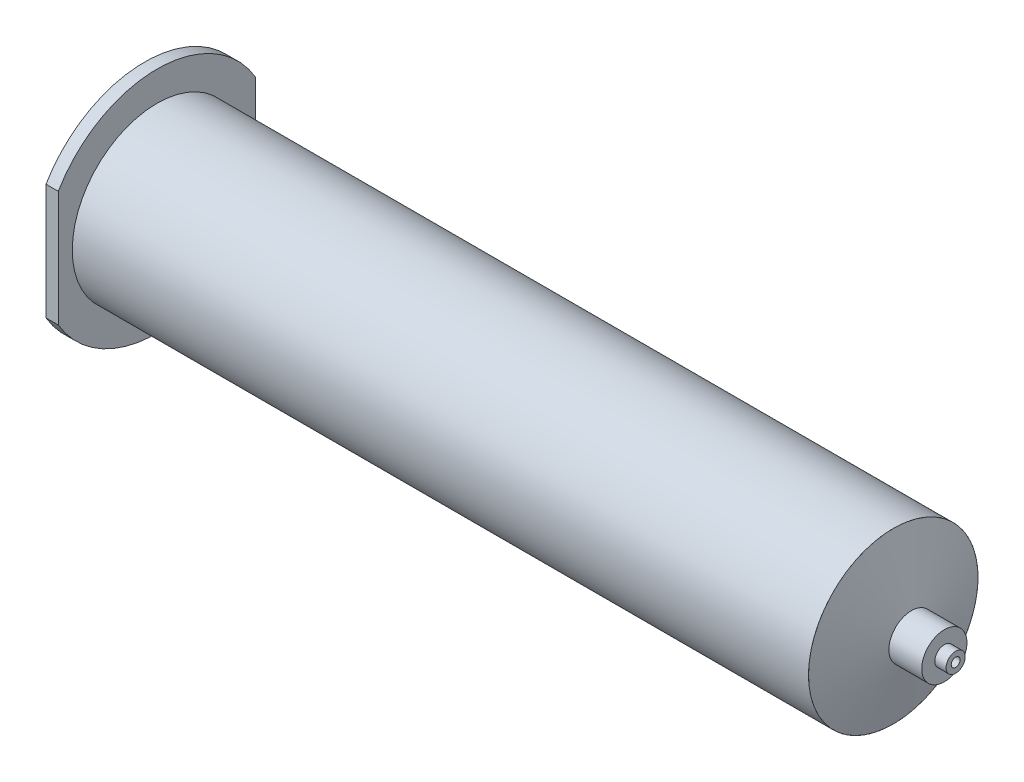
ISO-10303-21;
HEADER;
FILE_DESCRIPTION(('STEP AP214'),'2;1');
FILE_NAME('part.step','',(''),(''),'','','');
FILE_SCHEMA(('AUTOMOTIVE_DESIGN { 1 0 10303 214 1 1 1 1 }'));
ENDSEC;
DATA;
#1=APPLICATION_CONTEXT('core data for automotive mechanical design processes');
#2=APPLICATION_PROTOCOL_DEFINITION('international standard','automotive_design',2000,#1);
#3=PRODUCT_CONTEXT('',#1,'mechanical');
#4=PRODUCT('Part','Part','',(#3));
#5=PRODUCT_RELATED_PRODUCT_CATEGORY('part','',(#4));
#6=PRODUCT_DEFINITION_FORMATION('','',#4);
#7=PRODUCT_DEFINITION_CONTEXT('part definition',#1,'design');
#8=PRODUCT_DEFINITION('design','',#6,#7);
#9=PRODUCT_DEFINITION_SHAPE('','',#8);
#10=(LENGTH_UNIT() NAMED_UNIT(*) SI_UNIT(.MILLI.,.METRE.));
#11=(NAMED_UNIT(*) PLANE_ANGLE_UNIT() SI_UNIT($,.RADIAN.));
#12=(NAMED_UNIT(*) SI_UNIT($,.STERADIAN.) SOLID_ANGLE_UNIT());
#13=UNCERTAINTY_MEASURE_WITH_UNIT(LENGTH_MEASURE(1.E-05),#10,'distance_accuracy_value','');
#14=(GEOMETRIC_REPRESENTATION_CONTEXT(3) GLOBAL_UNCERTAINTY_ASSIGNED_CONTEXT((#13)) GLOBAL_UNIT_ASSIGNED_CONTEXT((#10,
#11,#12)) REPRESENTATION_CONTEXT('',''));
#15=CARTESIAN_POINT('',(0.,0.,0.));
#16=DIRECTION('',(0.,0.,1.));
#17=DIRECTION('',(1.,0.,0.));
#18=AXIS2_PLACEMENT_3D('',#15,#16,#17);
#19=CARTESIAN_POINT('',(0.,0.,0.));
#20=DIRECTION('',(1.,0.,0.));
#21=DIRECTION('',(0.,0.,-1.));
#22=AXIS2_PLACEMENT_3D('',#19,#20,#21);
#23=PLANE('',#22);
#24=CARTESIAN_POINT('',(0.,0.,17.25));
#25=DIRECTION('',(-1.,0.,0.));
#26=DIRECTION('',(0.,0.,1.));
#27=AXIS2_PLACEMENT_3D('',#24,#25,#26);
#28=CIRCLE('',#27,0.899999999999953);
#29=CARTESIAN_POINT('',(0.,0.,18.15));
#30=VERTEX_POINT('',#29);
#31=EDGE_CURVE('E67',#30,#30,#28,.T.);
#32=ORIENTED_EDGE('',*,*,#31,.T.);
#33=EDGE_LOOP('',(#32));
#34=FACE_BOUND('',#33,.T.);
#35=CARTESIAN_POINT('',(0.,0.,17.25));
#36=DIRECTION('',(1.,0.,0.));
#37=DIRECTION('',(0.,0.,-1.));
#38=AXIS2_PLACEMENT_3D('',#35,#36,#37);
#39=CIRCLE('',#38,1.94999999999998);
#40=CARTESIAN_POINT('',(0.,0.,15.3));
#41=VERTEX_POINT('',#40);
#42=EDGE_CURVE('E61',#41,#41,#39,.T.);
#43=ORIENTED_EDGE('',*,*,#42,.T.);
#44=EDGE_LOOP('',(#43));
#45=FACE_BOUND('',#44,.T.);
#46=ADVANCED_FACE('F54',(#34,#45),#23,.T.);
#47=CARTESIAN_POINT('',(-2.3,0.,0.));
#48=DIRECTION('',(1.,0.,0.));
#49=DIRECTION('',(0.,0.,-1.));
#50=AXIS2_PLACEMENT_3D('',#47,#48,#49);
#51=PLANE('',#50);
#52=CARTESIAN_POINT('',(-2.3,0.,17.25));
#53=DIRECTION('',(1.,0.,0.));
#54=DIRECTION('',(0.,0.,-1.));
#55=AXIS2_PLACEMENT_3D('',#52,#53,#54);
#56=CIRCLE('',#55,0.899999999999953);
#57=CARTESIAN_POINT('',(-2.3,0.,16.3500000000001));
#58=VERTEX_POINT('',#57);
#59=EDGE_CURVE('E57',#58,#58,#56,.T.);
#60=ORIENTED_EDGE('',*,*,#59,.T.);
#61=EDGE_LOOP('',(#60));
#62=FACE_BOUND('',#61,.T.);
#63=CARTESIAN_POINT('',(-2.3,0.,17.25));
#64=DIRECTION('',(1.,0.,0.));
#65=DIRECTION('',(0.,0.,-1.));
#66=AXIS2_PLACEMENT_3D('',#63,#64,#65);
#67=CIRCLE('',#66,1.94999999999998);
#68=CARTESIAN_POINT('',(-2.3,0.,15.3));
#69=VERTEX_POINT('',#68);
#70=EDGE_CURVE('E11',#69,#69,#67,.T.);
#71=ORIENTED_EDGE('',*,*,#70,.F.);
#72=EDGE_LOOP('',(#71));
#73=FACE_BOUND('',#72,.T.);
#74=ADVANCED_FACE('F74',(#62,#73),#51,.F.);
#75=CARTESIAN_POINT('',(0.,0.,17.25));
#76=DIRECTION('',(1.,0.,0.));
#77=DIRECTION('',(0.,0.,-1.));
#78=AXIS2_PLACEMENT_3D('',#75,#76,#77);
#79=CYLINDRICAL_SURFACE('',#78,1.94999999999998);
#80=ORIENTED_EDGE('',*,*,#42,.F.);
#81=EDGE_LOOP('',(#80));
#82=FACE_BOUND('',#81,.T.);
#83=ORIENTED_EDGE('',*,*,#70,.T.);
#84=EDGE_LOOP('',(#83));
#85=FACE_BOUND('',#84,.T.);
#86=ADVANCED_FACE('F79',(#82,#85),#79,.T.);
#87=CARTESIAN_POINT('',(-165.1,0.,17.25));
#88=DIRECTION('',(-1.,0.,0.));
#89=DIRECTION('',(0.,0.,1.));
#90=AXIS2_PLACEMENT_3D('',#87,#88,#89);
#91=CYLINDRICAL_SURFACE('',#90,0.899999999999953);
#92=ORIENTED_EDGE('',*,*,#31,.F.);
#93=EDGE_LOOP('',(#92));
#94=FACE_BOUND('',#93,.T.);
#95=ORIENTED_EDGE('',*,*,#59,.F.);
#96=EDGE_LOOP('',(#95));
#97=FACE_BOUND('',#96,.T.);
#98=ADVANCED_FACE('F77',(#94,#97),#91,.F.);
#99=CLOSED_SHELL('',(#46,#74,#86,#98));
#100=MANIFOLD_SOLID_BREP('B2',#99);
#101=CARTESIAN_POINT('',(-9.,0.,0.));
#102=DIRECTION('',(-1.,0.,0.));
#103=DIRECTION('',(0.,0.,1.));
#104=AXIS2_PLACEMENT_3D('',#101,#102,#103);
#105=PLANE('',#104);
#106=CARTESIAN_POINT('',(-9.00000000000001,0.,17.25));
#107=DIRECTION('',(-1.,0.,0.));
#108=DIRECTION('',(0.,0.,1.));
#109=AXIS2_PLACEMENT_3D('',#106,#107,#108);
#110=CIRCLE('',#109,0.899999999999953);
#111=CARTESIAN_POINT('',(-9.00000000000001,0.,18.15));
#112=VERTEX_POINT('',#111);
#113=EDGE_CURVE('E150',#112,#112,#110,.T.);
#114=ORIENTED_EDGE('',*,*,#113,.T.);
#115=EDGE_LOOP('',(#114));
#116=FACE_BOUND('',#115,.T.);
#117=CARTESIAN_POINT('',(-9.,0.,17.25));
#118=DIRECTION('',(1.,0.,0.));
#119=DIRECTION('',(0.,0.,-1.));
#120=AXIS2_PLACEMENT_3D('',#117,#118,#119);
#121=CIRCLE('',#120,1.95000000000003);
#122=CARTESIAN_POINT('',(-9.,0.,15.3));
#123=VERTEX_POINT('',#122);
#124=EDGE_CURVE('E53',#123,#123,#121,.T.);
#125=ORIENTED_EDGE('',*,*,#124,.T.);
#126=EDGE_LOOP('',(#125));
#127=FACE_BOUND('',#126,.T.);
#128=ADVANCED_FACE('F128',(#116,#127),#105,.F.);
#129=CARTESIAN_POINT('',(0.,0.,17.25));
#130=DIRECTION('',(1.,0.,0.));
#131=DIRECTION('',(0.,0.,-1.));
#132=AXIS2_PLACEMENT_3D('',#129,#130,#131);
#133=CYLINDRICAL_SURFACE('',#132,1.95000000000003);
#134=CARTESIAN_POINT('',(-2.3,0.,17.25));
#135=DIRECTION('',(1.,0.,0.));
#136=DIRECTION('',(0.,0.,-1.));
#137=AXIS2_PLACEMENT_3D('',#134,#135,#136);
#138=CIRCLE('',#137,1.95000000000003);
#139=CARTESIAN_POINT('',(-2.3,0.,15.3));
#140=VERTEX_POINT('',#139);
#141=EDGE_CURVE('E134',#140,#140,#138,.T.);
#142=ORIENTED_EDGE('',*,*,#141,.T.);
#143=EDGE_LOOP('',(#142));
#144=FACE_BOUND('',#143,.T.);
#145=ORIENTED_EDGE('',*,*,#124,.F.);
#146=EDGE_LOOP('',(#145));
#147=FACE_BOUND('',#146,.T.);
#148=ADVANCED_FACE('F175',(#144,#147),#133,.F.);
#149=CARTESIAN_POINT('',(-2.3,0.,0.));
#150=DIRECTION('',(-1.,0.,0.));
#151=DIRECTION('',(0.,0.,1.));
#152=AXIS2_PLACEMENT_3D('',#149,#150,#151);
#153=PLANE('',#152);
#154=ORIENTED_EDGE('',*,*,#141,.F.);
#155=EDGE_LOOP('',(#154));
#156=FACE_BOUND('',#155,.T.);
#157=CARTESIAN_POINT('',(-2.3,0.,17.25));
#158=DIRECTION('',(1.,0.,0.));
#159=DIRECTION('',(0.,0.,-1.));
#160=AXIS2_PLACEMENT_3D('',#157,#158,#159);
#161=CIRCLE('',#160,4.60000000000003);
#162=CARTESIAN_POINT('',(-2.3,0.,12.65));
#163=VERTEX_POINT('',#162);
#164=EDGE_CURVE('E138',#163,#163,#161,.T.);
#165=ORIENTED_EDGE('',*,*,#164,.T.);
#166=EDGE_LOOP('',(#165));
#167=FACE_BOUND('',#166,.T.);
#168=ADVANCED_FACE('F180',(#156,#167),#153,.F.);
#169=CARTESIAN_POINT('',(0.,0.,17.25));
#170=DIRECTION('',(1.,0.,0.));
#171=DIRECTION('',(0.,0.,-1.));
#172=AXIS2_PLACEMENT_3D('',#169,#170,#171);
#173=CYLINDRICAL_SURFACE('',#172,4.60000000000003);
#174=ORIENTED_EDGE('',*,*,#164,.F.);
#175=EDGE_LOOP('',(#174));
#176=FACE_BOUND('',#175,.T.);
#177=CARTESIAN_POINT('',(-9.,0.,17.25));
#178=DIRECTION('',(1.,0.,0.));
#179=DIRECTION('',(0.,0.,-1.));
#180=AXIS2_PLACEMENT_3D('',#177,#178,#179);
#181=CIRCLE('',#180,4.60000000000003);
#182=CARTESIAN_POINT('',(-8.99999999999999,0.,21.85));
#183=VERTEX_POINT('',#182);
#184=EDGE_CURVE('E142',#183,#183,#181,.T.);
#185=ORIENTED_EDGE('',*,*,#184,.T.);
#186=EDGE_LOOP('',(#185));
#187=FACE_BOUND('',#186,.T.);
#188=ADVANCED_FACE('F171',(#176,#187),#173,.T.);
#189=CARTESIAN_POINT('',(-12.7,0.,17.25));
#190=DIRECTION('',(-1.,0.,0.));
#191=DIRECTION('',(0.,0.,1.));
#192=AXIS2_PLACEMENT_3D('',#189,#190,#191);
#193=CONICAL_SURFACE('',#192,17.25,1.28624349239073);
#194=CARTESIAN_POINT('',(-12.7,0.,17.25));
#195=DIRECTION('',(1.,0.,0.));
#196=DIRECTION('',(0.,0.,-1.));
#197=AXIS2_PLACEMENT_3D('',#194,#195,#196);
#198=CIRCLE('',#197,17.25);
#199=CARTESIAN_POINT('',(-12.7,0.,34.5));
#200=VERTEX_POINT('',#199);
#201=EDGE_CURVE('E147',#200,#200,#198,.T.);
#202=CARTESIAN_POINT('',(-8.99999999999999,0.,21.85));
#203=CARTESIAN_POINT('',(-9.03854166666666,0.,21.9817708333334));
#204=CARTESIAN_POINT('',(-9.07708333333333,0.,22.1135416666667));
#205=CARTESIAN_POINT('',(-9.15416666666666,0.,22.3770833333334));
#206=CARTESIAN_POINT('',(-9.19270833333333,0.,22.5088541666667));
#207=CARTESIAN_POINT('',(-9.26979166666666,0.,22.7723958333334));
#208=CARTESIAN_POINT('',(-9.30833333333333,0.,22.9041666666667));
#209=CARTESIAN_POINT('',(-9.38541666666666,0.,23.1677083333334));
#210=CARTESIAN_POINT('',(-9.42395833333333,0.,23.2994791666667));
#211=CARTESIAN_POINT('',(-9.50104166666666,0.,23.5630208333334));
#212=CARTESIAN_POINT('',(-9.53958333333333,0.,23.6947916666667));
#213=CARTESIAN_POINT('',(-9.61666666666666,0.,23.9583333333334));
#214=CARTESIAN_POINT('',(-9.65520833333333,0.,24.0901041666667));
#215=CARTESIAN_POINT('',(-9.73229166666666,0.,24.3536458333334));
#216=CARTESIAN_POINT('',(-9.77083333333333,0.,24.4854166666667));
#217=CARTESIAN_POINT('',(-9.84791666666666,0.,24.7489583333334));
#218=CARTESIAN_POINT('',(-9.88645833333332,0.,24.8807291666667));
#219=CARTESIAN_POINT('',(-9.96354166666666,0.,25.1442708333334));
#220=CARTESIAN_POINT('',(-10.0020833333333,0.,25.2760416666667));
#221=CARTESIAN_POINT('',(-10.0791666666667,0.,25.5395833333334));
#222=CARTESIAN_POINT('',(-10.1177083333333,0.,25.6713541666667));
#223=CARTESIAN_POINT('',(-10.1947916666667,0.,25.9348958333334));
#224=CARTESIAN_POINT('',(-10.2333333333333,0.,26.0666666666667));
#225=CARTESIAN_POINT('',(-10.3104166666667,0.,26.3302083333334));
#226=CARTESIAN_POINT('',(-10.3489583333333,0.,26.4619791666667));
#227=CARTESIAN_POINT('',(-10.4260416666667,0.,26.7255208333334));
#228=CARTESIAN_POINT('',(-10.4645833333333,0.,26.8572916666667));
#229=CARTESIAN_POINT('',(-10.5416666666667,0.,27.1208333333334));
#230=CARTESIAN_POINT('',(-10.5802083333333,0.,27.2526041666667));
#231=CARTESIAN_POINT('',(-10.6572916666667,0.,27.5161458333334));
#232=CARTESIAN_POINT('',(-10.6958333333333,0.,27.6479166666667));
#233=CARTESIAN_POINT('',(-10.7729166666667,0.,27.9114583333334));
#234=CARTESIAN_POINT('',(-10.8114583333333,0.,28.0432291666667));
#235=CARTESIAN_POINT('',(-10.8885416666667,0.,28.3067708333334));
#236=CARTESIAN_POINT('',(-10.9270833333333,0.,28.4385416666667));
#237=CARTESIAN_POINT('',(-11.0041666666667,0.,28.7020833333334));
#238=CARTESIAN_POINT('',(-11.0427083333333,0.,28.8338541666667));
#239=CARTESIAN_POINT('',(-11.1197916666667,0.,29.0973958333334));
#240=CARTESIAN_POINT('',(-11.1583333333333,0.,29.2291666666667));
#241=CARTESIAN_POINT('',(-11.2354166666667,0.,29.4927083333334));
#242=CARTESIAN_POINT('',(-11.2739583333333,0.,29.6244791666667));
#243=CARTESIAN_POINT('',(-11.3510416666667,0.,29.8880208333333));
#244=CARTESIAN_POINT('',(-11.3895833333333,0.,30.0197916666667));
#245=CARTESIAN_POINT('',(-11.4666666666666,0.,30.2833333333334));
#246=CARTESIAN_POINT('',(-11.5052083333333,0.,30.4151041666667));
#247=CARTESIAN_POINT('',(-11.5822916666667,0.,30.6786458333334));
#248=CARTESIAN_POINT('',(-11.6208333333333,0.,30.8104166666667));
#249=CARTESIAN_POINT('',(-11.6979166666667,0.,31.0739583333333));
#250=CARTESIAN_POINT('',(-11.7364583333333,0.,31.2057291666667));
#251=CARTESIAN_POINT('',(-11.8135416666666,0.,31.4692708333333));
#252=CARTESIAN_POINT('',(-11.8520833333333,0.,31.6010416666667));
#253=CARTESIAN_POINT('',(-11.9291666666666,0.,31.8645833333333));
#254=CARTESIAN_POINT('',(-11.9677083333333,0.,31.9963541666667));
#255=CARTESIAN_POINT('',(-12.0447916666666,0.,32.2598958333334));
#256=CARTESIAN_POINT('',(-12.0833333333333,0.,32.3916666666667));
#257=CARTESIAN_POINT('',(-12.1604166666666,0.,32.6552083333333));
#258=CARTESIAN_POINT('',(-12.1989583333333,0.,32.7869791666667));
#259=CARTESIAN_POINT('',(-12.2760416666666,0.,33.0505208333333));
#260=CARTESIAN_POINT('',(-12.3145833333333,0.,33.1822916666667));
#261=CARTESIAN_POINT('',(-12.3916666666666,0.,33.4458333333333));
#262=CARTESIAN_POINT('',(-12.4302083333333,0.,33.5776041666667));
#263=CARTESIAN_POINT('',(-12.5072916666666,0.,33.8411458333333));
#264=CARTESIAN_POINT('',(-12.5458333333333,0.,33.9729166666667));
#265=CARTESIAN_POINT('',(-12.6229166666666,0.,34.2364583333333));
#266=CARTESIAN_POINT('',(-12.6614583333333,0.,34.3682291666667));
#267=CARTESIAN_POINT('',(-12.7,0.,34.5));
#268=B_SPLINE_CURVE_WITH_KNOTS('',3,(#202,#203,#204,#205,#206,#207,#208,#209,#210,#211,#212,
#213,#214,#215,#216,#217,#218,#219,#220,#221,#222,#223,#224,#225,#226,#227,#228,#229,#230,#231,
#232,#233,#234,#235,#236,#237,#238,#239,#240,#241,#242,#243,#244,#245,#246,#247,#248,#249,#250,
#251,#252,#253,#254,#255,#256,#257,#258,#259,#260,#261,#262,#263,#264,#265,#266,#267),
.UNSPECIFIED.,.F.,.F.,(4,2,2,2,2,2,2,2,2,2,2,2,2,2,2,2,2,2,2,2,2,2,2,2,2,2,2,2,2,2,2,2,4),(0.,
0.411875118550816,0.823750237101632,1.23562535565245,1.64750047420327,2.05937559275408,
2.4712507113049,2.88312582985572,3.29500094840653,3.70687606695735,4.11875118550817,
4.53062630405898,4.9425014226098,5.35437654116061,5.76625165971143,6.17812677826225,
6.59000189681307,7.00187701536388,7.4137521339147,7.82562725246552,8.23750237101633,
8.64937748956715,9.06125260811797,9.47312772666878,9.8850028452196,10.2968779637704,
10.7087530823212,11.120628200872,11.5325033194229,11.9443784379737,12.3562535565245,
12.7681286750753,13.1800037936261),.UNSPECIFIED.);
#269=EDGE_CURVE('BSEAM162',#183,#200,#268,.T.);
#270=ORIENTED_EDGE('',*,*,#184,.F.);
#271=ORIENTED_EDGE('',*,*,#201,.T.);
#272=ORIENTED_EDGE('',*,*,#269,.T.);
#273=ORIENTED_EDGE('',*,*,#269,.F.);
#274=EDGE_LOOP('',(#270,#272,#271,#273));
#275=FACE_BOUND('',#274,.T.);
#276=ADVANCED_FACE('F162',(#275),#193,.T.);
#277=CARTESIAN_POINT('',(-12.7,0.,0.));
#278=DIRECTION('',(-1.,0.,0.));
#279=DIRECTION('',(0.,0.,1.));
#280=AXIS2_PLACEMENT_3D('',#277,#278,#279);
#281=PLANE('',#280);
#282=ORIENTED_EDGE('',*,*,#201,.F.);
#283=EDGE_LOOP('',(#282));
#284=FACE_BOUND('',#283,.T.);
#285=CARTESIAN_POINT('',(-12.7,0.,17.25));
#286=DIRECTION('',(-1.,0.,0.));
#287=DIRECTION('',(0.,0.,1.));
#288=AXIS2_PLACEMENT_3D('',#285,#286,#287);
#289=CIRCLE('',#288,0.899999999999953);
#290=CARTESIAN_POINT('',(-12.7,0.,18.15));
#291=VERTEX_POINT('',#290);
#292=EDGE_CURVE('E153',#291,#291,#289,.T.);
#293=ORIENTED_EDGE('',*,*,#292,.F.);
#294=EDGE_LOOP('',(#293));
#295=FACE_BOUND('',#294,.T.);
#296=ADVANCED_FACE('F160',(#284,#295),#281,.T.);
#297=CARTESIAN_POINT('',(-165.1,0.,17.25));
#298=DIRECTION('',(-1.,0.,0.));
#299=DIRECTION('',(0.,0.,1.));
#300=AXIS2_PLACEMENT_3D('',#297,#298,#299);
#301=CYLINDRICAL_SURFACE('',#300,0.899999999999953);
#302=ORIENTED_EDGE('',*,*,#292,.T.);
#303=EDGE_LOOP('',(#302));
#304=FACE_BOUND('',#303,.T.);
#305=ORIENTED_EDGE('',*,*,#113,.F.);
#306=EDGE_LOOP('',(#305));
#307=FACE_BOUND('',#306,.T.);
#308=ADVANCED_FACE('F157',(#304,#307),#301,.F.);
#309=CLOSED_SHELL('',(#128,#148,#168,#188,#276,#296,#308));
#310=MANIFOLD_SOLID_BREP('B6',#309);
#311=CARTESIAN_POINT('',(0.,0.,17.25));
#312=DIRECTION('',(1.,0.,0.));
#313=DIRECTION('',(0.,0.,-1.));
#314=AXIS2_PLACEMENT_3D('',#311,#312,#313);
#315=CYLINDRICAL_SURFACE('',#314,17.25);
#316=CARTESIAN_POINT('',(-12.7,0.,17.25));
#317=DIRECTION('',(1.,0.,0.));
#318=DIRECTION('',(0.,0.,-1.));
#319=AXIS2_PLACEMENT_3D('',#316,#317,#318);
#320=CIRCLE('',#319,17.2500000000001);
#321=CARTESIAN_POINT('',(-12.7,0.,0.));
#322=VERTEX_POINT('',#321);
#323=EDGE_CURVE('E126',#322,#322,#320,.T.);
#324=ORIENTED_EDGE('',*,*,#323,.F.);
#325=EDGE_LOOP('',(#324));
#326=FACE_BOUND('',#325,.T.);
#327=CARTESIAN_POINT('',(-162.6,0.,17.2500000000001));
#328=DIRECTION('',(-1.,0.,0.));
#329=DIRECTION('',(0.,0.,1.));
#330=AXIS2_PLACEMENT_3D('',#327,#328,#329);
#331=CIRCLE('',#330,17.25);
#332=CARTESIAN_POINT('',(-162.6,0.,34.5000000000001));
#333=VERTEX_POINT('',#332);
#334=EDGE_CURVE('E242',#333,#333,#331,.F.);
#335=ORIENTED_EDGE('',*,*,#334,.T.);
#336=EDGE_LOOP('',(#335));
#337=FACE_BOUND('',#336,.T.);
#338=ADVANCED_FACE('F238',(#326,#337),#315,.T.);
#339=CARTESIAN_POINT('',(-12.7,0.,0.));
#340=DIRECTION('',(1.,0.,0.));
#341=DIRECTION('',(0.,0.,-1.));
#342=AXIS2_PLACEMENT_3D('',#339,#340,#341);
#343=PLANE('',#342);
#344=CARTESIAN_POINT('',(-12.7,0.,17.25));
#345=DIRECTION('',(-1.,0.,0.));
#346=DIRECTION('',(0.,0.,1.));
#347=AXIS2_PLACEMENT_3D('',#344,#345,#346);
#348=CIRCLE('',#347,15.4499999999999);
#349=CARTESIAN_POINT('',(-12.7,0.,32.7));
#350=VERTEX_POINT('',#349);
#351=EDGE_CURVE('E315',#350,#350,#348,.T.);
#352=ORIENTED_EDGE('',*,*,#351,.T.);
#353=EDGE_LOOP('',(#352));
#354=FACE_BOUND('',#353,.T.);
#355=ORIENTED_EDGE('',*,*,#323,.T.);
#356=EDGE_LOOP('',(#355));
#357=FACE_BOUND('',#356,.T.);
#358=ADVANCED_FACE('F240',(#354,#357),#343,.T.);
#359=CARTESIAN_POINT('',(-162.6,0.,17.2500000000001));
#360=DIRECTION('',(-1.,0.,0.));
#361=DIRECTION('',(0.,0.,1.));
#362=AXIS2_PLACEMENT_3D('',#359,#360,#361);
#363=CYLINDRICAL_SURFACE('',#362,23.3);
#364=CARTESIAN_POINT('',(-165.1,0.,17.2500000000001));
#365=DIRECTION('',(-1.,0.,0.));
#366=DIRECTION('',(0.,0.,1.));
#367=AXIS2_PLACEMENT_3D('',#364,#365,#366);
#368=CIRCLE('',#367,23.3);
#369=CARTESIAN_POINT('',(-165.1,-11.784735890125,-2.84999999999994));
#370=VERTEX_POINT('',#369);
#371=CARTESIAN_POINT('',(-165.1,-11.784735890125,37.3500000000001));
#372=VERTEX_POINT('',#371);
#373=EDGE_CURVE('E310',#370,#372,#368,.T.);
#374=ORIENTED_EDGE('',*,*,#373,.F.);
#375=DIRECTION('',(-1.,0.,0.));
#376=VECTOR('',#375,1.);
#377=CARTESIAN_POINT('',(-162.6,-11.784735890125,-2.84999999999994));
#378=LINE('',#377,#376);
#379=CARTESIAN_POINT('',(-162.6,-11.784735890125,-2.84999999999994));
#380=VERTEX_POINT('',#379);
#381=EDGE_CURVE('E256',#380,#370,#378,.T.);
#382=ORIENTED_EDGE('',*,*,#381,.F.);
#383=CARTESIAN_POINT('',(-162.6,0.,17.2500000000001));
#384=DIRECTION('',(-1.,0.,0.));
#385=DIRECTION('',(0.,0.,1.));
#386=AXIS2_PLACEMENT_3D('',#383,#384,#385);
#387=CIRCLE('',#386,23.3);
#388=CARTESIAN_POINT('',(-162.6,-11.784735890125,37.3500000000001));
#389=VERTEX_POINT('',#388);
#390=EDGE_CURVE('E300',#380,#389,#387,.T.);
#391=ORIENTED_EDGE('',*,*,#390,.T.);
#392=DIRECTION('',(-1.,0.,0.));
#393=VECTOR('',#392,1.);
#394=CARTESIAN_POINT('',(-162.6,-11.784735890125,37.3500000000001));
#395=LINE('',#394,#393);
#396=EDGE_CURVE('E296',#389,#372,#395,.T.);
#397=ORIENTED_EDGE('',*,*,#396,.T.);
#398=EDGE_LOOP('',(#374,#382,#391,#397));
#399=FACE_BOUND('',#398,.T.);
#400=ADVANCED_FACE('F329',(#399),#363,.T.);
#401=CARTESIAN_POINT('',(-162.6,0.,-2.84999999999994));
#402=DIRECTION('',(0.,0.,-1.));
#403=DIRECTION('',(-1.,0.,0.));
#404=AXIS2_PLACEMENT_3D('',#401,#402,#403);
#405=PLANE('',#404);
#406=DIRECTION('',(0.,-1.,0.));
#407=VECTOR('',#406,1.);
#408=CARTESIAN_POINT('',(-165.1,0.,-2.84999999999994));
#409=LINE('',#408,#407);
#410=CARTESIAN_POINT('',(-165.1,11.784735890125,-2.84999999999994));
#411=VERTEX_POINT('',#410);
#412=EDGE_CURVE('E320',#411,#370,#409,.T.);
#413=ORIENTED_EDGE('',*,*,#412,.F.);
#414=DIRECTION('',(-1.,0.,0.));
#415=VECTOR('',#414,1.);
#416=CARTESIAN_POINT('',(-162.6,11.784735890125,-2.84999999999994));
#417=LINE('',#416,#415);
#418=CARTESIAN_POINT('',(-162.6,11.784735890125,-2.84999999999994));
#419=VERTEX_POINT('',#418);
#420=EDGE_CURVE('E273',#419,#411,#417,.T.);
#421=ORIENTED_EDGE('',*,*,#420,.F.);
#422=DIRECTION('',(0.,-1.,0.));
#423=VECTOR('',#422,1.);
#424=CARTESIAN_POINT('',(-162.6,0.,-2.84999999999994));
#425=LINE('',#424,#423);
#426=EDGE_CURVE('E303',#419,#380,#425,.T.);
#427=ORIENTED_EDGE('',*,*,#426,.T.);
#428=ORIENTED_EDGE('',*,*,#381,.T.);
#429=EDGE_LOOP('',(#413,#421,#427,#428));
#430=FACE_BOUND('',#429,.T.);
#431=ADVANCED_FACE('F332',(#430),#405,.T.);
#432=CARTESIAN_POINT('',(-162.6,0.,17.2500000000001));
#433=DIRECTION('',(-1.,0.,0.));
#434=DIRECTION('',(0.,0.,1.));
#435=AXIS2_PLACEMENT_3D('',#432,#433,#434);
#436=CYLINDRICAL_SURFACE('',#435,23.3);
#437=CARTESIAN_POINT('',(-165.1,0.,17.2500000000001));
#438=DIRECTION('',(-1.,0.,0.));
#439=DIRECTION('',(0.,0.,1.));
#440=AXIS2_PLACEMENT_3D('',#437,#438,#439);
#441=CIRCLE('',#440,23.3);
#442=CARTESIAN_POINT('',(-165.1,11.784735890125,37.3500000000001));
#443=VERTEX_POINT('',#442);
#444=EDGE_CURVE('E291',#443,#411,#441,.T.);
#445=ORIENTED_EDGE('',*,*,#444,.F.);
#446=DIRECTION('',(-1.,0.,0.));
#447=VECTOR('',#446,1.);
#448=CARTESIAN_POINT('',(-162.6,11.784735890125,37.3500000000001));
#449=LINE('',#448,#447);
#450=CARTESIAN_POINT('',(-162.6,11.784735890125,37.3500000000001));
#451=VERTEX_POINT('',#450);
#452=EDGE_CURVE('E287',#451,#443,#449,.T.);
#453=ORIENTED_EDGE('',*,*,#452,.F.);
#454=CARTESIAN_POINT('',(-162.6,0.,17.2500000000001));
#455=DIRECTION('',(-1.,0.,0.));
#456=DIRECTION('',(0.,0.,1.));
#457=AXIS2_PLACEMENT_3D('',#454,#455,#456);
#458=CIRCLE('',#457,23.3);
#459=EDGE_CURVE('E289',#451,#419,#458,.T.);
#460=ORIENTED_EDGE('',*,*,#459,.T.);
#461=ORIENTED_EDGE('',*,*,#420,.T.);
#462=EDGE_LOOP('',(#445,#453,#460,#461));
#463=FACE_BOUND('',#462,.T.);
#464=ADVANCED_FACE('F288',(#463),#436,.T.);
#465=CARTESIAN_POINT('',(-162.6,0.,37.3500000000001));
#466=DIRECTION('',(0.,0.,-1.));
#467=DIRECTION('',(-1.,0.,0.));
#468=AXIS2_PLACEMENT_3D('',#465,#466,#467);
#469=PLANE('',#468);
#470=DIRECTION('',(0.,-1.,0.));
#471=VECTOR('',#470,1.);
#472=CARTESIAN_POINT('',(-165.1,0.,37.3500000000001));
#473=LINE('',#472,#471);
#474=EDGE_CURVE('E314',#443,#372,#473,.T.);
#475=ORIENTED_EDGE('',*,*,#474,.T.);
#476=ORIENTED_EDGE('',*,*,#396,.F.);
#477=DIRECTION('',(0.,-1.,0.));
#478=VECTOR('',#477,1.);
#479=CARTESIAN_POINT('',(-162.6,0.,37.3500000000001));
#480=LINE('',#479,#478);
#481=EDGE_CURVE('E284',#451,#389,#480,.T.);
#482=ORIENTED_EDGE('',*,*,#481,.F.);
#483=ORIENTED_EDGE('',*,*,#452,.T.);
#484=EDGE_LOOP('',(#475,#476,#482,#483));
#485=FACE_BOUND('',#484,.T.);
#486=ADVANCED_FACE('F298',(#485),#469,.F.);
#487=CARTESIAN_POINT('',(-162.6,0.,0.));
#488=DIRECTION('',(-1.,0.,0.));
#489=DIRECTION('',(0.,0.,1.));
#490=AXIS2_PLACEMENT_3D('',#487,#488,#489);
#491=PLANE('',#490);
#492=ORIENTED_EDGE('',*,*,#334,.F.);
#493=EDGE_LOOP('',(#492));
#494=FACE_BOUND('',#493,.T.);
#495=ORIENTED_EDGE('',*,*,#390,.F.);
#496=ORIENTED_EDGE('',*,*,#426,.F.);
#497=ORIENTED_EDGE('',*,*,#459,.F.);
#498=ORIENTED_EDGE('',*,*,#481,.T.);
#499=EDGE_LOOP('',(#495,#496,#497,#498));
#500=FACE_BOUND('',#499,.T.);
#501=ADVANCED_FACE('F302',(#494,#500),#491,.F.);
#502=CARTESIAN_POINT('',(-165.1,0.,0.));
#503=DIRECTION('',(1.,0.,0.));
#504=DIRECTION('',(0.,0.,-1.));
#505=AXIS2_PLACEMENT_3D('',#502,#503,#504);
#506=PLANE('',#505);
#507=CARTESIAN_POINT('',(-165.1,0.,17.25));
#508=DIRECTION('',(-1.,0.,0.));
#509=DIRECTION('',(0.,0.,1.));
#510=AXIS2_PLACEMENT_3D('',#507,#508,#509);
#511=CIRCLE('',#510,15.45);
#512=CARTESIAN_POINT('',(-165.1,0.,32.7));
#513=VERTEX_POINT('',#512);
#514=EDGE_CURVE('E364',#513,#513,#511,.T.);
#515=ORIENTED_EDGE('',*,*,#514,.F.);
#516=EDGE_LOOP('',(#515));
#517=FACE_BOUND('',#516,.T.);
#518=ORIENTED_EDGE('',*,*,#373,.T.);
#519=ORIENTED_EDGE('',*,*,#474,.F.);
#520=ORIENTED_EDGE('',*,*,#444,.T.);
#521=ORIENTED_EDGE('',*,*,#412,.T.);
#522=EDGE_LOOP('',(#518,#519,#520,#521));
#523=FACE_BOUND('',#522,.T.);
#524=ADVANCED_FACE('F331',(#517,#523),#506,.F.);
#525=CARTESIAN_POINT('',(-165.1,0.,17.25));
#526=DIRECTION('',(-1.,0.,0.));
#527=DIRECTION('',(0.,0.,1.));
#528=AXIS2_PLACEMENT_3D('',#525,#526,#527);
#529=CYLINDRICAL_SURFACE('',#528,15.45);
#530=ORIENTED_EDGE('',*,*,#351,.F.);
#531=EDGE_LOOP('',(#530));
#532=FACE_BOUND('',#531,.T.);
#533=ORIENTED_EDGE('',*,*,#514,.T.);
#534=EDGE_LOOP('',(#533));
#535=FACE_BOUND('',#534,.T.);
#536=ADVANCED_FACE('F353',(#532,#535),#529,.F.);
#537=CLOSED_SHELL('',(#338,#358,#400,#431,#464,#486,#501,#524,#536));
#538=MANIFOLD_SOLID_BREP('B48',#537);
#539=ADVANCED_BREP_SHAPE_REPRESENTATION('',(#18,#100,#310,#538),#14);
#540=SHAPE_DEFINITION_REPRESENTATION(#9,#539);
ENDSEC;
END-ISO-10303-21;
